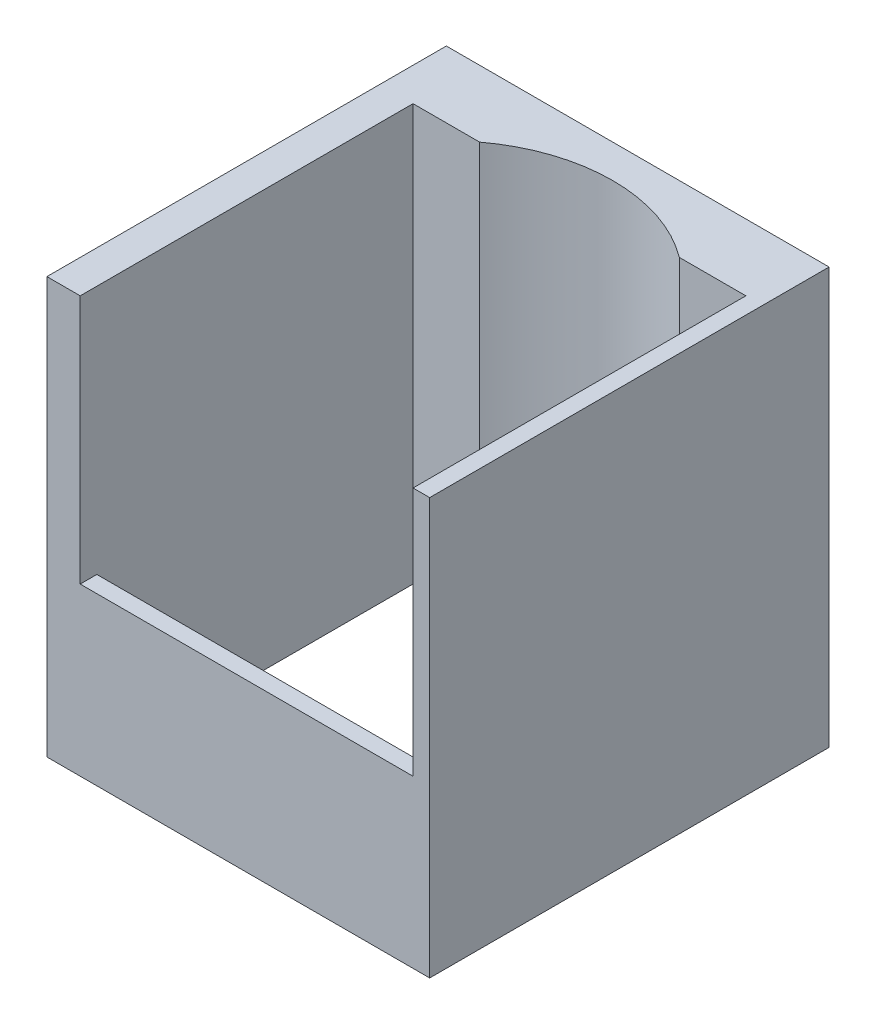
ISO-10303-21;
HEADER;
FILE_DESCRIPTION(('STEP AP214'),'2;1');
FILE_NAME('part.step','',(''),(''),'','','');
FILE_SCHEMA(('AUTOMOTIVE_DESIGN { 1 0 10303 214 1 1 1 1 }'));
ENDSEC;
DATA;
#1=APPLICATION_CONTEXT('core data for automotive mechanical design processes');
#2=APPLICATION_PROTOCOL_DEFINITION('international standard','automotive_design',2000,#1);
#3=PRODUCT_CONTEXT('',#1,'mechanical');
#4=PRODUCT('Part','Part','',(#3));
#5=PRODUCT_RELATED_PRODUCT_CATEGORY('part','',(#4));
#6=PRODUCT_DEFINITION_FORMATION('','',#4);
#7=PRODUCT_DEFINITION_CONTEXT('part definition',#1,'design');
#8=PRODUCT_DEFINITION('design','',#6,#7);
#9=PRODUCT_DEFINITION_SHAPE('','',#8);
#10=(LENGTH_UNIT() NAMED_UNIT(*) SI_UNIT(.MILLI.,.METRE.));
#11=(NAMED_UNIT(*) PLANE_ANGLE_UNIT() SI_UNIT($,.RADIAN.));
#12=(NAMED_UNIT(*) SI_UNIT($,.STERADIAN.) SOLID_ANGLE_UNIT());
#13=UNCERTAINTY_MEASURE_WITH_UNIT(LENGTH_MEASURE(1.E-05),#10,'distance_accuracy_value','');
#14=(GEOMETRIC_REPRESENTATION_CONTEXT(3) GLOBAL_UNCERTAINTY_ASSIGNED_CONTEXT((#13)) GLOBAL_UNIT_ASSIGNED_CONTEXT((#10,
#11,#12)) REPRESENTATION_CONTEXT('',''));
#15=CARTESIAN_POINT('',(0.,0.,0.));
#16=DIRECTION('',(0.,0.,1.));
#17=DIRECTION('',(1.,0.,0.));
#18=AXIS2_PLACEMENT_3D('',#15,#16,#17);
#19=CARTESIAN_POINT('',(0.,530.,0.));
#20=DIRECTION('',(0.,0.,-1.));
#21=DIRECTION('',(-1.,0.,0.));
#22=AXIS2_PLACEMENT_3D('',#19,#20,#21);
#23=PLANE('',#22);
#24=DIRECTION('',(0.,1.,0.));
#25=VECTOR('',#24,1.);
#26=CARTESIAN_POINT('',(115.,530.,0.));
#27=LINE('',#26,#25);
#28=CARTESIAN_POINT('',(115.,280.,0.));
#29=VERTEX_POINT('',#28);
#30=CARTESIAN_POINT('',(115.,405.,0.));
#31=VERTEX_POINT('',#30);
#32=EDGE_CURVE('E61',#29,#31,#27,.T.);
#33=ORIENTED_EDGE('',*,*,#32,.T.);
#34=DIRECTION('',(-1.,0.,0.));
#35=VECTOR('',#34,1.);
#36=CARTESIAN_POINT('',(0.,405.,0.));
#37=LINE('',#36,#35);
#38=CARTESIAN_POINT('',(110.,405.,0.));
#39=VERTEX_POINT('',#38);
#40=EDGE_CURVE('E54',#31,#39,#37,.T.);
#41=ORIENTED_EDGE('',*,*,#40,.T.);
#42=DIRECTION('',(0.,1.,0.));
#43=VECTOR('',#42,1.);
#44=CARTESIAN_POINT('',(110.,280.,0.));
#45=LINE('',#44,#43);
#46=CARTESIAN_POINT('',(110.,330.,0.));
#47=VERTEX_POINT('',#46);
#48=EDGE_CURVE('E224',#47,#39,#45,.T.);
#49=ORIENTED_EDGE('',*,*,#48,.F.);
#50=DIRECTION('',(-1.,0.,0.));
#51=VECTOR('',#50,1.);
#52=CARTESIAN_POINT('',(9.99999999999982,330.,0.));
#53=LINE('',#52,#51);
#54=CARTESIAN_POINT('',(9.99999999999982,330.,0.));
#55=VERTEX_POINT('',#54);
#56=EDGE_CURVE('E191',#47,#55,#53,.T.);
#57=ORIENTED_EDGE('',*,*,#56,.T.);
#58=DIRECTION('',(0.,-1.,0.));
#59=VECTOR('',#58,1.);
#60=CARTESIAN_POINT('',(9.99999999999982,280.,0.));
#61=LINE('',#60,#59);
#62=CARTESIAN_POINT('',(9.99999999999982,405.,0.));
#63=VERTEX_POINT('',#62);
#64=EDGE_CURVE('E222',#63,#55,#61,.T.);
#65=ORIENTED_EDGE('',*,*,#64,.F.);
#66=CARTESIAN_POINT('',(0.,405.,0.));
#67=VERTEX_POINT('',#66);
#68=EDGE_CURVE('E247',#63,#67,#37,.T.);
#69=ORIENTED_EDGE('',*,*,#68,.T.);
#70=DIRECTION('',(0.,-1.,0.));
#71=VECTOR('',#70,1.);
#72=CARTESIAN_POINT('',(0.,530.,0.));
#73=LINE('',#72,#71);
#74=CARTESIAN_POINT('',(0.,280.,0.));
#75=VERTEX_POINT('',#74);
#76=EDGE_CURVE('E143',#67,#75,#73,.T.);
#77=ORIENTED_EDGE('',*,*,#76,.T.);
#78=DIRECTION('',(-1.,0.,0.));
#79=VECTOR('',#78,1.);
#80=CARTESIAN_POINT('',(0.,280.,0.));
#81=LINE('',#80,#79);
#82=EDGE_CURVE('E193',#29,#75,#81,.T.);
#83=ORIENTED_EDGE('',*,*,#82,.F.);
#84=EDGE_LOOP('',(#33,#41,#49,#57,#65,#69,#77,#83));
#85=FACE_BOUND('',#84,.T.);
#86=ADVANCED_FACE('F38',(#85),#23,.F.);
#87=CARTESIAN_POINT('',(0.,0.,-100.));
#88=DIRECTION('',(0.,0.,-1.));
#89=DIRECTION('',(-1.,0.,0.));
#90=AXIS2_PLACEMENT_3D('',#87,#88,#89);
#91=PLANE('',#90);
#92=DIRECTION('',(0.,1.,0.));
#93=VECTOR('',#92,1.);
#94=CARTESIAN_POINT('',(30.,270.,-100.));
#95=LINE('',#94,#93);
#96=CARTESIAN_POINT('',(30.,280.,-100.));
#97=VERTEX_POINT('',#96);
#98=CARTESIAN_POINT('',(30.,405.,-100.));
#99=VERTEX_POINT('',#98);
#100=EDGE_CURVE('E11',#97,#99,#95,.T.);
#101=ORIENTED_EDGE('',*,*,#100,.T.);
#102=DIRECTION('',(-1.,0.,0.));
#103=VECTOR('',#102,1.);
#104=CARTESIAN_POINT('',(0.,405.,-100.));
#105=LINE('',#104,#103);
#106=CARTESIAN_POINT('',(9.99999999999982,405.,-100.));
#107=VERTEX_POINT('',#106);
#108=EDGE_CURVE('E245',#99,#107,#105,.T.);
#109=ORIENTED_EDGE('',*,*,#108,.T.);
#110=DIRECTION('',(0.,-1.,0.));
#111=VECTOR('',#110,1.);
#112=CARTESIAN_POINT('',(9.99999999999982,280.,-100.));
#113=LINE('',#112,#111);
#114=CARTESIAN_POINT('',(9.99999999999982,280.,-100.));
#115=VERTEX_POINT('',#114);
#116=EDGE_CURVE('E182',#107,#115,#113,.T.);
#117=ORIENTED_EDGE('',*,*,#116,.T.);
#118=DIRECTION('',(1.,0.,0.));
#119=VECTOR('',#118,1.);
#120=CARTESIAN_POINT('',(9.99999999999982,280.,-100.));
#121=LINE('',#120,#119);
#122=EDGE_CURVE('E181',#115,#97,#121,.T.);
#123=ORIENTED_EDGE('',*,*,#122,.T.);
#124=EDGE_LOOP('',(#101,#109,#117,#123));
#125=FACE_BOUND('',#124,.T.);
#126=ADVANCED_FACE('F276',(#125),#91,.F.);
#127=CARTESIAN_POINT('',(0.,530.,0.));
#128=DIRECTION('',(1.,0.,0.));
#129=DIRECTION('',(0.,0.,-1.));
#130=AXIS2_PLACEMENT_3D('',#127,#128,#129);
#131=PLANE('',#130);
#132=ORIENTED_EDGE('',*,*,#76,.F.);
#133=DIRECTION('',(0.,0.,1.));
#134=VECTOR('',#133,1.);
#135=CARTESIAN_POINT('',(0.,405.,-120.));
#136=LINE('',#135,#134);
#137=CARTESIAN_POINT('',(0.,405.,-120.));
#138=VERTEX_POINT('',#137);
#139=EDGE_CURVE('E130',#138,#67,#136,.T.);
#140=ORIENTED_EDGE('',*,*,#139,.F.);
#141=DIRECTION('',(0.,-1.,0.));
#142=VECTOR('',#141,1.);
#143=CARTESIAN_POINT('',(0.,530.,-120.));
#144=LINE('',#143,#142);
#145=CARTESIAN_POINT('',(0.,280.,-120.));
#146=VERTEX_POINT('',#145);
#147=EDGE_CURVE('E141',#138,#146,#144,.T.);
#148=ORIENTED_EDGE('',*,*,#147,.T.);
#149=DIRECTION('',(0.,0.,1.));
#150=VECTOR('',#149,1.);
#151=CARTESIAN_POINT('',(0.,280.,-159.));
#152=LINE('',#151,#150);
#153=EDGE_CURVE('E187',#146,#75,#152,.T.);
#154=ORIENTED_EDGE('',*,*,#153,.T.);
#155=EDGE_LOOP('',(#132,#140,#148,#154));
#156=FACE_BOUND('',#155,.T.);
#157=ADVANCED_FACE('F40',(#156),#131,.F.);
#158=CARTESIAN_POINT('',(0.,530.,-120.));
#159=DIRECTION('',(0.,0.,1.));
#160=DIRECTION('',(1.,0.,0.));
#161=AXIS2_PLACEMENT_3D('',#158,#159,#160);
#162=PLANE('',#161);
#163=ORIENTED_EDGE('',*,*,#147,.F.);
#164=DIRECTION('',(1.,0.,0.));
#165=VECTOR('',#164,1.);
#166=CARTESIAN_POINT('',(0.,405.,-120.));
#167=LINE('',#166,#165);
#168=CARTESIAN_POINT('',(115.,405.,-120.));
#169=VERTEX_POINT('',#168);
#170=EDGE_CURVE('E127',#138,#169,#167,.T.);
#171=ORIENTED_EDGE('',*,*,#170,.T.);
#172=DIRECTION('',(0.,-1.,0.));
#173=VECTOR('',#172,1.);
#174=CARTESIAN_POINT('',(115.,280.,-120.));
#175=LINE('',#174,#173);
#176=CARTESIAN_POINT('',(115.,280.,-120.));
#177=VERTEX_POINT('',#176);
#178=EDGE_CURVE('E255',#169,#177,#175,.T.);
#179=ORIENTED_EDGE('',*,*,#178,.T.);
#180=DIRECTION('',(-1.,0.,0.));
#181=VECTOR('',#180,1.);
#182=CARTESIAN_POINT('',(0.,280.,-120.));
#183=LINE('',#182,#181);
#184=EDGE_CURVE('E148',#177,#146,#183,.T.);
#185=ORIENTED_EDGE('',*,*,#184,.T.);
#186=EDGE_LOOP('',(#163,#171,#179,#185));
#187=FACE_BOUND('',#186,.T.);
#188=ADVANCED_FACE('F146',(#187),#162,.F.);
#189=CARTESIAN_POINT('',(9.99999999999982,280.,-100.));
#190=DIRECTION('',(-1.,0.,0.));
#191=DIRECTION('',(0.,0.,1.));
#192=AXIS2_PLACEMENT_3D('',#189,#190,#191);
#193=PLANE('',#192);
#194=ORIENTED_EDGE('',*,*,#116,.F.);
#195=DIRECTION('',(0.,0.,1.));
#196=VECTOR('',#195,1.);
#197=CARTESIAN_POINT('',(9.99999999999982,405.,-100.));
#198=LINE('',#197,#196);
#199=EDGE_CURVE('E244',#107,#63,#198,.T.);
#200=ORIENTED_EDGE('',*,*,#199,.T.);
#201=ORIENTED_EDGE('',*,*,#64,.T.);
#202=DIRECTION('',(0.,0.,1.));
#203=VECTOR('',#202,1.);
#204=CARTESIAN_POINT('',(9.99999999999982,330.,-5.));
#205=LINE('',#204,#203);
#206=CARTESIAN_POINT('',(9.99999999999982,330.,-5.));
#207=VERTEX_POINT('',#206);
#208=EDGE_CURVE('E208',#207,#55,#205,.T.);
#209=ORIENTED_EDGE('',*,*,#208,.F.);
#210=DIRECTION('',(0.,-1.,0.));
#211=VECTOR('',#210,1.);
#212=CARTESIAN_POINT('',(9.99999999999982,280.,-5.));
#213=LINE('',#212,#211);
#214=CARTESIAN_POINT('',(9.99999999999982,280.,-5.));
#215=VERTEX_POINT('',#214);
#216=EDGE_CURVE('E197',#207,#215,#213,.T.);
#217=ORIENTED_EDGE('',*,*,#216,.T.);
#218=DIRECTION('',(0.,0.,1.));
#219=VECTOR('',#218,1.);
#220=CARTESIAN_POINT('',(9.99999999999982,280.,-100.));
#221=LINE('',#220,#219);
#222=EDGE_CURVE('E156',#115,#215,#221,.T.);
#223=ORIENTED_EDGE('',*,*,#222,.F.);
#224=EDGE_LOOP('',(#194,#200,#201,#209,#217,#223));
#225=FACE_BOUND('',#224,.T.);
#226=ADVANCED_FACE('F280',(#225),#193,.F.);
#227=CARTESIAN_POINT('',(110.,280.,-100.));
#228=DIRECTION('',(1.,0.,0.));
#229=DIRECTION('',(0.,0.,-1.));
#230=AXIS2_PLACEMENT_3D('',#227,#228,#229);
#231=PLANE('',#230);
#232=ORIENTED_EDGE('',*,*,#48,.T.);
#233=DIRECTION('',(0.,0.,-1.));
#234=VECTOR('',#233,1.);
#235=CARTESIAN_POINT('',(110.,405.,-100.));
#236=LINE('',#235,#234);
#237=CARTESIAN_POINT('',(110.,405.,-100.));
#238=VERTEX_POINT('',#237);
#239=EDGE_CURVE('E237',#39,#238,#236,.T.);
#240=ORIENTED_EDGE('',*,*,#239,.T.);
#241=DIRECTION('',(0.,1.,0.));
#242=VECTOR('',#241,1.);
#243=CARTESIAN_POINT('',(110.,280.,-100.));
#244=LINE('',#243,#242);
#245=CARTESIAN_POINT('',(110.,280.,-100.));
#246=VERTEX_POINT('',#245);
#247=EDGE_CURVE('E227',#246,#238,#244,.T.);
#248=ORIENTED_EDGE('',*,*,#247,.F.);
#249=DIRECTION('',(0.,0.,1.));
#250=VECTOR('',#249,1.);
#251=CARTESIAN_POINT('',(110.,280.,-100.));
#252=LINE('',#251,#250);
#253=CARTESIAN_POINT('',(110.,280.,-5.));
#254=VERTEX_POINT('',#253);
#255=EDGE_CURVE('E151',#246,#254,#252,.T.);
#256=ORIENTED_EDGE('',*,*,#255,.T.);
#257=DIRECTION('',(0.,1.,0.));
#258=VECTOR('',#257,1.);
#259=CARTESIAN_POINT('',(110.,280.,-5.));
#260=LINE('',#259,#258);
#261=CARTESIAN_POINT('',(110.,330.,-5.));
#262=VERTEX_POINT('',#261);
#263=EDGE_CURVE('E215',#254,#262,#260,.T.);
#264=ORIENTED_EDGE('',*,*,#263,.T.);
#265=DIRECTION('',(0.,0.,1.));
#266=VECTOR('',#265,1.);
#267=CARTESIAN_POINT('',(110.,330.,-100.));
#268=LINE('',#267,#266);
#269=EDGE_CURVE('E218',#262,#47,#268,.T.);
#270=ORIENTED_EDGE('',*,*,#269,.T.);
#271=EDGE_LOOP('',(#232,#240,#248,#256,#264,#270));
#272=FACE_BOUND('',#271,.T.);
#273=ADVANCED_FACE('F236',(#272),#231,.F.);
#274=ORIENTED_EDGE('',*,*,#247,.T.);
#275=DIRECTION('',(-1.,0.,0.));
#276=VECTOR('',#275,1.);
#277=CARTESIAN_POINT('',(0.,405.,-100.));
#278=LINE('',#277,#276);
#279=CARTESIAN_POINT('',(90.0000000000001,405.,-100.));
#280=VERTEX_POINT('',#279);
#281=EDGE_CURVE('E169',#238,#280,#278,.T.);
#282=ORIENTED_EDGE('',*,*,#281,.T.);
#283=DIRECTION('',(0.,1.,0.));
#284=VECTOR('',#283,1.);
#285=CARTESIAN_POINT('',(90.0000000000001,270.,-100.));
#286=LINE('',#285,#284);
#287=CARTESIAN_POINT('',(90.0000000000001,280.,-100.));
#288=VERTEX_POINT('',#287);
#289=EDGE_CURVE('E47',#280,#288,#286,.F.);
#290=ORIENTED_EDGE('',*,*,#289,.T.);
#291=EDGE_CURVE('E167',#288,#246,#121,.T.);
#292=ORIENTED_EDGE('',*,*,#291,.T.);
#293=EDGE_LOOP('',(#274,#282,#290,#292));
#294=FACE_BOUND('',#293,.T.);
#295=ADVANCED_FACE('F166',(#294),#91,.F.);
#296=CARTESIAN_POINT('',(60.,270.,-60.));
#297=DIRECTION('',(0.,1.,0.));
#298=DIRECTION('',(0.,0.,1.));
#299=AXIS2_PLACEMENT_3D('',#296,#297,#298);
#300=CYLINDRICAL_SURFACE('',#299,50.);
#301=ORIENTED_EDGE('',*,*,#289,.F.);
#302=CARTESIAN_POINT('',(60.,405.,-60.));
#303=DIRECTION('',(0.,-1.,0.));
#304=DIRECTION('',(0.,0.,-1.));
#305=AXIS2_PLACEMENT_3D('',#302,#303,#304);
#306=CIRCLE('',#305,50.);
#307=EDGE_CURVE('E267',#280,#99,#306,.F.);
#308=ORIENTED_EDGE('',*,*,#307,.T.);
#309=ORIENTED_EDGE('',*,*,#100,.F.);
#310=CARTESIAN_POINT('',(60.,280.,-60.));
#311=DIRECTION('',(0.,1.,0.));
#312=DIRECTION('',(0.,0.,1.));
#313=AXIS2_PLACEMENT_3D('',#310,#311,#312);
#314=CIRCLE('',#313,50.);
#315=EDGE_CURVE('E177',#97,#288,#314,.F.);
#316=ORIENTED_EDGE('',*,*,#315,.T.);
#317=EDGE_LOOP('',(#301,#308,#309,#316));
#318=FACE_BOUND('',#317,.T.);
#319=ADVANCED_FACE('F184',(#318),#300,.F.);
#320=CARTESIAN_POINT('',(9.99999999999982,330.,-5.));
#321=DIRECTION('',(0.,1.,0.));
#322=DIRECTION('',(0.,0.,1.));
#323=AXIS2_PLACEMENT_3D('',#320,#321,#322);
#324=PLANE('',#323);
#325=ORIENTED_EDGE('',*,*,#269,.F.);
#326=DIRECTION('',(-1.,0.,0.));
#327=VECTOR('',#326,1.);
#328=CARTESIAN_POINT('',(9.99999999999982,330.,-5.));
#329=LINE('',#328,#327);
#330=EDGE_CURVE('E204',#262,#207,#329,.T.);
#331=ORIENTED_EDGE('',*,*,#330,.T.);
#332=ORIENTED_EDGE('',*,*,#208,.T.);
#333=ORIENTED_EDGE('',*,*,#56,.F.);
#334=EDGE_LOOP('',(#325,#331,#332,#333));
#335=FACE_BOUND('',#334,.T.);
#336=ADVANCED_FACE('F289',(#335),#324,.T.);
#337=CARTESIAN_POINT('',(0.,0.,-5.));
#338=DIRECTION('',(0.,0.,-1.));
#339=DIRECTION('',(-1.,0.,0.));
#340=AXIS2_PLACEMENT_3D('',#337,#338,#339);
#341=PLANE('',#340);
#342=ORIENTED_EDGE('',*,*,#263,.F.);
#343=DIRECTION('',(1.,0.,0.));
#344=VECTOR('',#343,1.);
#345=CARTESIAN_POINT('',(9.99999999999982,280.,-5.));
#346=LINE('',#345,#344);
#347=EDGE_CURVE('E201',#215,#254,#346,.T.);
#348=ORIENTED_EDGE('',*,*,#347,.F.);
#349=ORIENTED_EDGE('',*,*,#216,.F.);
#350=ORIENTED_EDGE('',*,*,#330,.F.);
#351=EDGE_LOOP('',(#342,#348,#349,#350));
#352=FACE_BOUND('',#351,.T.);
#353=ADVANCED_FACE('F287',(#352),#341,.T.);
#354=CARTESIAN_POINT('',(0.,280.,-159.));
#355=DIRECTION('',(0.,1.,0.));
#356=DIRECTION('',(0.,0.,1.));
#357=AXIS2_PLACEMENT_3D('',#354,#355,#356);
#358=PLANE('',#357);
#359=ORIENTED_EDGE('',*,*,#222,.T.);
#360=ORIENTED_EDGE('',*,*,#347,.T.);
#361=ORIENTED_EDGE('',*,*,#255,.F.);
#362=ORIENTED_EDGE('',*,*,#291,.F.);
#363=ORIENTED_EDGE('',*,*,#315,.F.);
#364=ORIENTED_EDGE('',*,*,#122,.F.);
#365=EDGE_LOOP('',(#359,#360,#361,#362,#363,#364));
#366=FACE_BOUND('',#365,.T.);
#367=ORIENTED_EDGE('',*,*,#184,.F.);
#368=DIRECTION('',(0.,0.,1.));
#369=VECTOR('',#368,1.);
#370=CARTESIAN_POINT('',(115.,280.,-120.));
#371=LINE('',#370,#369);
#372=EDGE_CURVE('E257',#177,#29,#371,.T.);
#373=ORIENTED_EDGE('',*,*,#372,.T.);
#374=ORIENTED_EDGE('',*,*,#82,.T.);
#375=ORIENTED_EDGE('',*,*,#153,.F.);
#376=EDGE_LOOP('',(#367,#373,#374,#375));
#377=FACE_BOUND('',#376,.T.);
#378=ADVANCED_FACE('F174',(#366,#377),#358,.F.);
#379=CARTESIAN_POINT('',(115.,280.,-120.));
#380=DIRECTION('',(-1.,0.,0.));
#381=DIRECTION('',(0.,-1.,0.));
#382=AXIS2_PLACEMENT_3D('',#379,#380,#381);
#383=PLANE('',#382);
#384=ORIENTED_EDGE('',*,*,#178,.F.);
#385=DIRECTION('',(0.,0.,1.));
#386=VECTOR('',#385,1.);
#387=CARTESIAN_POINT('',(115.,405.,-120.));
#388=LINE('',#387,#386);
#389=EDGE_CURVE('E132',#169,#31,#388,.T.);
#390=ORIENTED_EDGE('',*,*,#389,.T.);
#391=ORIENTED_EDGE('',*,*,#32,.F.);
#392=ORIENTED_EDGE('',*,*,#372,.F.);
#393=EDGE_LOOP('',(#384,#390,#391,#392));
#394=FACE_BOUND('',#393,.T.);
#395=ADVANCED_FACE('F265',(#394),#383,.F.);
#396=CARTESIAN_POINT('',(0.,405.,-120.));
#397=DIRECTION('',(0.,-1.,0.));
#398=DIRECTION('',(0.,0.,-1.));
#399=AXIS2_PLACEMENT_3D('',#396,#397,#398);
#400=PLANE('',#399);
#401=ORIENTED_EDGE('',*,*,#199,.F.);
#402=ORIENTED_EDGE('',*,*,#108,.F.);
#403=ORIENTED_EDGE('',*,*,#307,.F.);
#404=ORIENTED_EDGE('',*,*,#281,.F.);
#405=ORIENTED_EDGE('',*,*,#239,.F.);
#406=ORIENTED_EDGE('',*,*,#40,.F.);
#407=ORIENTED_EDGE('',*,*,#389,.F.);
#408=ORIENTED_EDGE('',*,*,#170,.F.);
#409=ORIENTED_EDGE('',*,*,#139,.T.);
#410=ORIENTED_EDGE('',*,*,#68,.F.);
#411=EDGE_LOOP('',(#401,#402,#403,#404,#405,#406,#407,#408,#409,#410));
#412=FACE_BOUND('',#411,.T.);
#413=ADVANCED_FACE('F129',(#412),#400,.F.);
#414=CLOSED_SHELL('',(#86,#126,#157,#188,#226,#273,#295,#319,#336,#353,#378,#395,#413));
#415=MANIFOLD_SOLID_BREP('B2',#414);
#416=ADVANCED_BREP_SHAPE_REPRESENTATION('',(#18,#415),#14);
#417=SHAPE_DEFINITION_REPRESENTATION(#9,#416);
ENDSEC;
END-ISO-10303-21;
